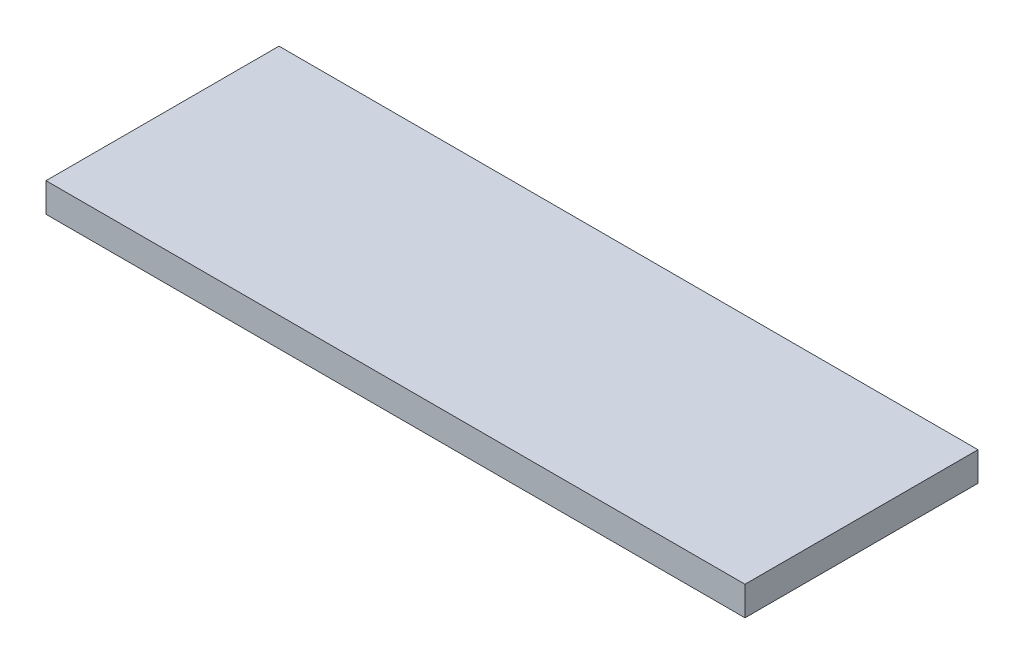
ISO-10303-21;
HEADER;
FILE_DESCRIPTION(('STEP AP214'),'2;1');
FILE_NAME('part.step','',(''),(''),'','','');
FILE_SCHEMA(('AUTOMOTIVE_DESIGN { 1 0 10303 214 1 1 1 1 }'));
ENDSEC;
DATA;
#1=APPLICATION_CONTEXT('core data for automotive mechanical design processes');
#2=APPLICATION_PROTOCOL_DEFINITION('international standard','automotive_design',2000,#1);
#3=PRODUCT_CONTEXT('',#1,'mechanical');
#4=PRODUCT('Part','Part','',(#3));
#5=PRODUCT_RELATED_PRODUCT_CATEGORY('part','',(#4));
#6=PRODUCT_DEFINITION_FORMATION('','',#4);
#7=PRODUCT_DEFINITION_CONTEXT('part definition',#1,'design');
#8=PRODUCT_DEFINITION('design','',#6,#7);
#9=PRODUCT_DEFINITION_SHAPE('','',#8);
#10=(LENGTH_UNIT() NAMED_UNIT(*) SI_UNIT(.MILLI.,.METRE.));
#11=(NAMED_UNIT(*) PLANE_ANGLE_UNIT() SI_UNIT($,.RADIAN.));
#12=(NAMED_UNIT(*) SI_UNIT($,.STERADIAN.) SOLID_ANGLE_UNIT());
#13=UNCERTAINTY_MEASURE_WITH_UNIT(LENGTH_MEASURE(1.E-05),#10,'distance_accuracy_value','');
#14=(GEOMETRIC_REPRESENTATION_CONTEXT(3) GLOBAL_UNCERTAINTY_ASSIGNED_CONTEXT((#13)) GLOBAL_UNIT_ASSIGNED_CONTEXT((#10,
#11,#12)) REPRESENTATION_CONTEXT('',''));
#15=CARTESIAN_POINT('',(0.,0.,0.));
#16=DIRECTION('',(0.,0.,1.));
#17=DIRECTION('',(1.,0.,0.));
#18=AXIS2_PLACEMENT_3D('',#15,#16,#17);
#19=CARTESIAN_POINT('',(-3.02213511474371,0.25,1.00012248707541));
#20=DIRECTION('',(-1.,0.,0.));
#21=DIRECTION('',(0.,0.,1.));
#22=AXIS2_PLACEMENT_3D('',#19,#20,#21);
#23=PLANE('',#22);
#24=DIRECTION('',(0.,0.,-1.));
#25=VECTOR('',#24,1.);
#26=CARTESIAN_POINT('',(-3.02213511474371,0.,1.00012248707541));
#27=LINE('',#26,#25);
#28=CARTESIAN_POINT('',(-3.02213511474371,0.,1.00012248707541));
#29=VERTEX_POINT('',#28);
#30=CARTESIAN_POINT('',(-3.02213511474371,0.,-0.999877512924592));
#31=VERTEX_POINT('',#30);
#32=EDGE_CURVE('E98',#29,#31,#27,.T.);
#33=ORIENTED_EDGE('',*,*,#32,.F.);
#34=DIRECTION('',(0.,-1.,0.));
#35=VECTOR('',#34,1.);
#36=CARTESIAN_POINT('',(-3.02213511474371,0.25,1.00012248707541));
#37=LINE('',#36,#35);
#38=CARTESIAN_POINT('',(-3.02213511474371,0.25,1.00012248707541));
#39=VERTEX_POINT('',#38);
#40=EDGE_CURVE('E11',#39,#29,#37,.T.);
#41=ORIENTED_EDGE('',*,*,#40,.F.);
#42=DIRECTION('',(0.,0.,-1.));
#43=VECTOR('',#42,1.);
#44=CARTESIAN_POINT('',(-3.02213511474371,0.25,1.00012248707541));
#45=LINE('',#44,#43);
#46=CARTESIAN_POINT('',(-3.02213511474371,0.25,-0.999877512924592));
#47=VERTEX_POINT('',#46);
#48=EDGE_CURVE('E93',#39,#47,#45,.T.);
#49=ORIENTED_EDGE('',*,*,#48,.T.);
#50=DIRECTION('',(0.,-1.,0.));
#51=VECTOR('',#50,1.);
#52=CARTESIAN_POINT('',(-3.02213511474371,0.25,-0.999877512924592));
#53=LINE('',#52,#51);
#54=EDGE_CURVE('E36',#47,#31,#53,.T.);
#55=ORIENTED_EDGE('',*,*,#54,.T.);
#56=EDGE_LOOP('',(#33,#41,#49,#55));
#57=FACE_BOUND('',#56,.T.);
#58=ADVANCED_FACE('F33',(#57),#23,.T.);
#59=CARTESIAN_POINT('',(-3.02213511474371,0.25,1.00012248707541));
#60=DIRECTION('',(0.,0.,-1.));
#61=DIRECTION('',(-1.,0.,0.));
#62=AXIS2_PLACEMENT_3D('',#59,#60,#61);
#63=PLANE('',#62);
#64=DIRECTION('',(1.,0.,0.));
#65=VECTOR('',#64,1.);
#66=CARTESIAN_POINT('',(-3.02213511474371,0.,1.00012248707541));
#67=LINE('',#66,#65);
#68=CARTESIAN_POINT('',(2.97786488525629,0.,1.00012248707541));
#69=VERTEX_POINT('',#68);
#70=EDGE_CURVE('E66',#29,#69,#67,.T.);
#71=ORIENTED_EDGE('',*,*,#70,.T.);
#72=DIRECTION('',(0.,-1.,0.));
#73=VECTOR('',#72,1.);
#74=CARTESIAN_POINT('',(2.97786488525629,0.25,1.00012248707541));
#75=LINE('',#74,#73);
#76=CARTESIAN_POINT('',(2.97786488525629,0.25,1.00012248707541));
#77=VERTEX_POINT('',#76);
#78=EDGE_CURVE('E42',#77,#69,#75,.T.);
#79=ORIENTED_EDGE('',*,*,#78,.F.);
#80=DIRECTION('',(1.,0.,0.));
#81=VECTOR('',#80,1.);
#82=CARTESIAN_POINT('',(-3.02213511474371,0.25,1.00012248707541));
#83=LINE('',#82,#81);
#84=EDGE_CURVE('E83',#39,#77,#83,.T.);
#85=ORIENTED_EDGE('',*,*,#84,.F.);
#86=ORIENTED_EDGE('',*,*,#40,.T.);
#87=EDGE_LOOP('',(#71,#79,#85,#86));
#88=FACE_BOUND('',#87,.T.);
#89=ADVANCED_FACE('F108',(#88),#63,.F.);
#90=CARTESIAN_POINT('',(2.97786488525629,0.25,1.00012248707541));
#91=DIRECTION('',(-1.,0.,0.));
#92=DIRECTION('',(0.,0.,1.));
#93=AXIS2_PLACEMENT_3D('',#90,#91,#92);
#94=PLANE('',#93);
#95=DIRECTION('',(0.,0.,-1.));
#96=VECTOR('',#95,1.);
#97=CARTESIAN_POINT('',(2.97786488525629,0.,1.00012248707541));
#98=LINE('',#97,#96);
#99=CARTESIAN_POINT('',(2.97786488525629,0.,-0.999877512924592));
#100=VERTEX_POINT('',#99);
#101=EDGE_CURVE('E90',#69,#100,#98,.T.);
#102=ORIENTED_EDGE('',*,*,#101,.T.);
#103=DIRECTION('',(0.,-1.,0.));
#104=VECTOR('',#103,1.);
#105=CARTESIAN_POINT('',(2.97786488525629,0.25,-0.999877512924592));
#106=LINE('',#105,#104);
#107=CARTESIAN_POINT('',(2.97786488525629,0.25,-0.999877512924592));
#108=VERTEX_POINT('',#107);
#109=EDGE_CURVE('E87',#108,#100,#106,.T.);
#110=ORIENTED_EDGE('',*,*,#109,.F.);
#111=DIRECTION('',(0.,0.,-1.));
#112=VECTOR('',#111,1.);
#113=CARTESIAN_POINT('',(2.97786488525629,0.25,1.00012248707541));
#114=LINE('',#113,#112);
#115=EDGE_CURVE('E78',#77,#108,#114,.T.);
#116=ORIENTED_EDGE('',*,*,#115,.F.);
#117=ORIENTED_EDGE('',*,*,#78,.T.);
#118=EDGE_LOOP('',(#102,#110,#116,#117));
#119=FACE_BOUND('',#118,.T.);
#120=ADVANCED_FACE('F88',(#119),#94,.F.);
#121=CARTESIAN_POINT('',(-3.02213511474371,0.25,-0.999877512924592));
#122=DIRECTION('',(0.,0.,-1.));
#123=DIRECTION('',(-1.,0.,0.));
#124=AXIS2_PLACEMENT_3D('',#121,#122,#123);
#125=PLANE('',#124);
#126=DIRECTION('',(1.,0.,0.));
#127=VECTOR('',#126,1.);
#128=CARTESIAN_POINT('',(-3.02213511474371,0.,-0.999877512924592));
#129=LINE('',#128,#127);
#130=EDGE_CURVE('E101',#31,#100,#129,.T.);
#131=ORIENTED_EDGE('',*,*,#130,.F.);
#132=ORIENTED_EDGE('',*,*,#54,.F.);
#133=DIRECTION('',(1.,0.,0.));
#134=VECTOR('',#133,1.);
#135=CARTESIAN_POINT('',(-3.02213511474371,0.25,-0.999877512924592));
#136=LINE('',#135,#134);
#137=EDGE_CURVE('E82',#47,#108,#136,.T.);
#138=ORIENTED_EDGE('',*,*,#137,.T.);
#139=ORIENTED_EDGE('',*,*,#109,.T.);
#140=EDGE_LOOP('',(#131,#132,#138,#139));
#141=FACE_BOUND('',#140,.T.);
#142=ADVANCED_FACE('F92',(#141),#125,.T.);
#143=CARTESIAN_POINT('',(0.,0.25,0.));
#144=DIRECTION('',(0.,-1.,0.));
#145=DIRECTION('',(0.,0.,-1.));
#146=AXIS2_PLACEMENT_3D('',#143,#144,#145);
#147=PLANE('',#146);
#148=ORIENTED_EDGE('',*,*,#48,.F.);
#149=ORIENTED_EDGE('',*,*,#84,.T.);
#150=ORIENTED_EDGE('',*,*,#115,.T.);
#151=ORIENTED_EDGE('',*,*,#137,.F.);
#152=EDGE_LOOP('',(#148,#149,#150,#151));
#153=FACE_BOUND('',#152,.T.);
#154=ADVANCED_FACE('F81',(#153),#147,.F.);
#155=CARTESIAN_POINT('',(0.,0.,0.));
#156=DIRECTION('',(0.,-1.,0.));
#157=DIRECTION('',(0.,0.,-1.));
#158=AXIS2_PLACEMENT_3D('',#155,#156,#157);
#159=PLANE('',#158);
#160=ORIENTED_EDGE('',*,*,#32,.T.);
#161=ORIENTED_EDGE('',*,*,#130,.T.);
#162=ORIENTED_EDGE('',*,*,#101,.F.);
#163=ORIENTED_EDGE('',*,*,#70,.F.);
#164=EDGE_LOOP('',(#160,#161,#162,#163));
#165=FACE_BOUND('',#164,.T.);
#166=ADVANCED_FACE('F106',(#165),#159,.T.);
#167=CLOSED_SHELL('',(#58,#89,#120,#142,#154,#166));
#168=MANIFOLD_SOLID_BREP('B2',#167);
#169=ADVANCED_BREP_SHAPE_REPRESENTATION('',(#18,#168),#14);
#170=SHAPE_DEFINITION_REPRESENTATION(#9,#169);
ENDSEC;
END-ISO-10303-21;
